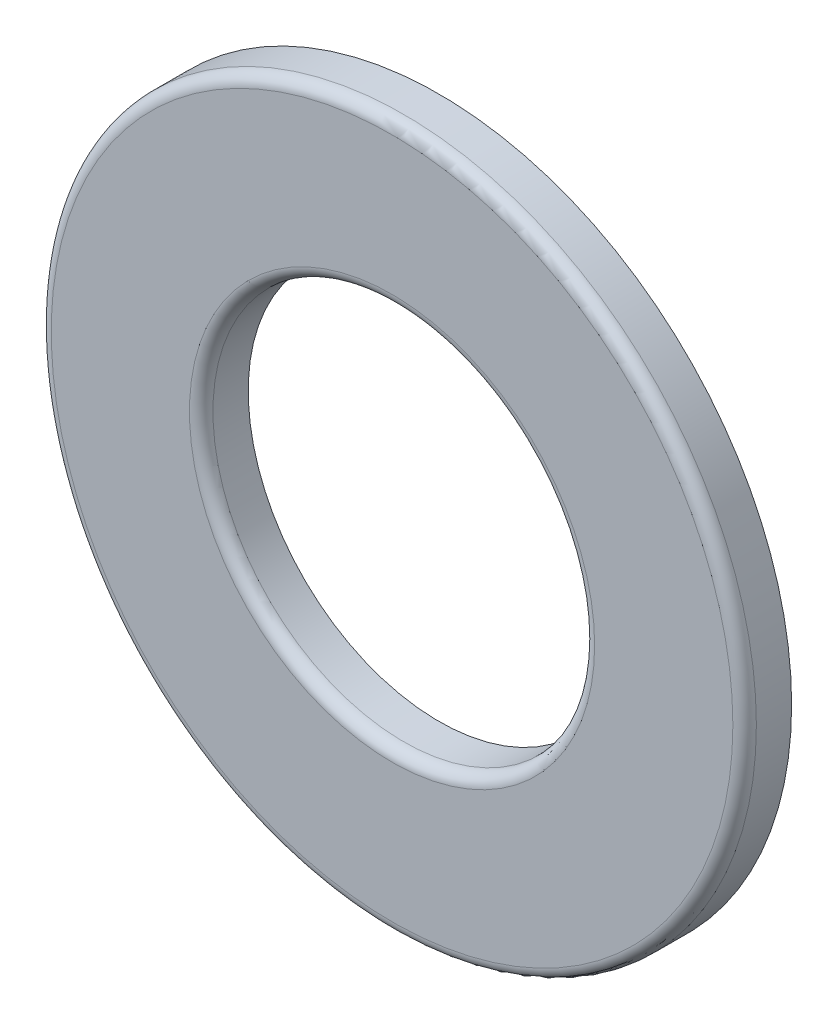
ISO-10303-21;
HEADER;
FILE_DESCRIPTION(('STEP AP214'),'2;1');
FILE_NAME('part.step','',(''),(''),'','','');
FILE_SCHEMA(('AUTOMOTIVE_DESIGN { 1 0 10303 214 1 1 1 1 }'));
ENDSEC;
DATA;
#1=APPLICATION_CONTEXT('core data for automotive mechanical design processes');
#2=APPLICATION_PROTOCOL_DEFINITION('international standard','automotive_design',2000,#1);
#3=PRODUCT_CONTEXT('',#1,'mechanical');
#4=PRODUCT('Part','Part','',(#3));
#5=PRODUCT_RELATED_PRODUCT_CATEGORY('part','',(#4));
#6=PRODUCT_DEFINITION_FORMATION('','',#4);
#7=PRODUCT_DEFINITION_CONTEXT('part definition',#1,'design');
#8=PRODUCT_DEFINITION('design','',#6,#7);
#9=PRODUCT_DEFINITION_SHAPE('','',#8);
#10=(LENGTH_UNIT() NAMED_UNIT(*) SI_UNIT(.MILLI.,.METRE.));
#11=(NAMED_UNIT(*) PLANE_ANGLE_UNIT() SI_UNIT($,.RADIAN.));
#12=(NAMED_UNIT(*) SI_UNIT($,.STERADIAN.) SOLID_ANGLE_UNIT());
#13=UNCERTAINTY_MEASURE_WITH_UNIT(LENGTH_MEASURE(1.E-05),#10,'distance_accuracy_value','');
#14=(GEOMETRIC_REPRESENTATION_CONTEXT(3) GLOBAL_UNCERTAINTY_ASSIGNED_CONTEXT((#13)) GLOBAL_UNIT_ASSIGNED_CONTEXT((#10,
#11,#12)) REPRESENTATION_CONTEXT('',''));
#15=CARTESIAN_POINT('',(0.,0.,0.));
#16=DIRECTION('',(0.,0.,1.));
#17=DIRECTION('',(1.,0.,0.));
#18=AXIS2_PLACEMENT_3D('',#15,#16,#17);
#19=CARTESIAN_POINT('',(0.,0.,0.634999999999997));
#20=DIRECTION('',(0.,0.,1.));
#21=DIRECTION('',(1.,0.,0.));
#22=AXIS2_PLACEMENT_3D('',#19,#20,#21);
#23=PLANE('',#22);
#24=CARTESIAN_POINT('',(0.,0.,0.634999999999997));
#25=DIRECTION('',(0.,0.,1.));
#26=DIRECTION('',(1.,0.,0.));
#27=AXIS2_PLACEMENT_3D('',#24,#25,#26);
#28=CIRCLE('',#27,9.2075);
#29=CARTESIAN_POINT('',(9.2075,0.,0.634999999999997));
#30=VERTEX_POINT('',#29);
#31=EDGE_CURVE('E44',#30,#30,#28,.T.);
#32=ORIENTED_EDGE('',*,*,#31,.T.);
#33=EDGE_LOOP('',(#32));
#34=FACE_BOUND('',#33,.T.);
#35=CARTESIAN_POINT('',(0.,0.,0.634999999999997));
#36=DIRECTION('',(0.,0.,1.));
#37=DIRECTION('',(1.,0.,0.));
#38=AXIS2_PLACEMENT_3D('',#35,#36,#37);
#39=CIRCLE('',#38,5.4737);
#40=CARTESIAN_POINT('',(5.4737,0.,0.634999999999997));
#41=VERTEX_POINT('',#40);
#42=EDGE_CURVE('E48',#41,#41,#39,.F.);
#43=ORIENTED_EDGE('',*,*,#42,.T.);
#44=EDGE_LOOP('',(#43));
#45=FACE_BOUND('',#44,.T.);
#46=ADVANCED_FACE('F33',(#34,#45),#23,.T.);
#47=CARTESIAN_POINT('',(0.,0.,0.634999999999997));
#48=DIRECTION('',(0.,0.,-1.));
#49=DIRECTION('',(-1.,0.,0.));
#50=AXIS2_PLACEMENT_3D('',#47,#48,#49);
#51=CYLINDRICAL_SURFACE('',#50,9.525);
#52=CARTESIAN_POINT('',(0.,0.,0.317499999999997));
#53=DIRECTION('',(0.,0.,1.));
#54=DIRECTION('',(1.,0.,0.));
#55=AXIS2_PLACEMENT_3D('',#52,#53,#54);
#56=CIRCLE('',#55,9.525);
#57=CARTESIAN_POINT('',(9.525,0.,0.317499999999997));
#58=VERTEX_POINT('',#57);
#59=EDGE_CURVE('E40',#58,#58,#56,.F.);
#60=ORIENTED_EDGE('',*,*,#59,.T.);
#61=EDGE_LOOP('',(#60));
#62=FACE_BOUND('',#61,.T.);
#63=CARTESIAN_POINT('',(0.,0.,-0.635000000000003));
#64=DIRECTION('',(0.,0.,1.));
#65=DIRECTION('',(1.,0.,0.));
#66=AXIS2_PLACEMENT_3D('',#63,#64,#65);
#67=CIRCLE('',#66,9.525);
#68=CARTESIAN_POINT('',(9.525,0.,-0.635000000000003));
#69=VERTEX_POINT('',#68);
#70=EDGE_CURVE('E53',#69,#69,#67,.T.);
#71=ORIENTED_EDGE('',*,*,#70,.T.);
#72=EDGE_LOOP('',(#71));
#73=FACE_BOUND('',#72,.T.);
#74=ADVANCED_FACE('F65',(#62,#73),#51,.T.);
#75=CARTESIAN_POINT('',(0.,0.,0.634999999999997));
#76=DIRECTION('',(0.,0.,-1.));
#77=DIRECTION('',(-1.,0.,0.));
#78=AXIS2_PLACEMENT_3D('',#75,#76,#77);
#79=CYLINDRICAL_SURFACE('',#78,5.1562);
#80=CARTESIAN_POINT('',(0.,0.,0.317499999999997));
#81=DIRECTION('',(0.,0.,1.));
#82=DIRECTION('',(1.,0.,0.));
#83=AXIS2_PLACEMENT_3D('',#80,#81,#82);
#84=CIRCLE('',#83,5.1562);
#85=CARTESIAN_POINT('',(5.1562,0.,0.317499999999997));
#86=VERTEX_POINT('',#85);
#87=EDGE_CURVE('E10',#86,#86,#84,.T.);
#88=ORIENTED_EDGE('',*,*,#87,.T.);
#89=EDGE_LOOP('',(#88));
#90=FACE_BOUND('',#89,.T.);
#91=CARTESIAN_POINT('',(0.,0.,-0.635000000000003));
#92=DIRECTION('',(0.,0.,1.));
#93=DIRECTION('',(1.,0.,0.));
#94=AXIS2_PLACEMENT_3D('',#91,#92,#93);
#95=CIRCLE('',#94,5.1562);
#96=CARTESIAN_POINT('',(5.1562,0.,-0.635000000000003));
#97=VERTEX_POINT('',#96);
#98=EDGE_CURVE('E56',#97,#97,#95,.T.);
#99=ORIENTED_EDGE('',*,*,#98,.F.);
#100=EDGE_LOOP('',(#99));
#101=FACE_BOUND('',#100,.T.);
#102=ADVANCED_FACE('F63',(#90,#101),#79,.F.);
#103=CARTESIAN_POINT('',(0.,0.,-0.635000000000003));
#104=DIRECTION('',(0.,0.,1.));
#105=DIRECTION('',(1.,0.,0.));
#106=AXIS2_PLACEMENT_3D('',#103,#104,#105);
#107=PLANE('',#106);
#108=ORIENTED_EDGE('',*,*,#98,.T.);
#109=EDGE_LOOP('',(#108));
#110=FACE_BOUND('',#109,.T.);
#111=ORIENTED_EDGE('',*,*,#70,.F.);
#112=EDGE_LOOP('',(#111));
#113=FACE_BOUND('',#112,.T.);
#114=ADVANCED_FACE('F60',(#110,#113),#107,.F.);
#115=CARTESIAN_POINT('',(0.,0.,0.317499999999997));
#116=DIRECTION('',(0.,0.,1.));
#117=DIRECTION('',(1.,0.,0.));
#118=AXIS2_PLACEMENT_3D('',#115,#116,#117);
#119=TOROIDAL_SURFACE('',#118,9.2075,0.3175);
#120=ORIENTED_EDGE('',*,*,#59,.F.);
#121=EDGE_LOOP('',(#120));
#122=FACE_BOUND('',#121,.T.);
#123=ORIENTED_EDGE('',*,*,#31,.F.);
#124=EDGE_LOOP('',(#123));
#125=FACE_BOUND('',#124,.T.);
#126=ADVANCED_FACE('F71',(#122,#125),#119,.T.);
#127=CARTESIAN_POINT('',(0.,0.,0.317499999999997));
#128=DIRECTION('',(0.,0.,1.));
#129=DIRECTION('',(1.,0.,0.));
#130=AXIS2_PLACEMENT_3D('',#127,#128,#129);
#131=TOROIDAL_SURFACE('',#130,5.4737,0.3175);
#132=ORIENTED_EDGE('',*,*,#42,.F.);
#133=EDGE_LOOP('',(#132));
#134=FACE_BOUND('',#133,.T.);
#135=ORIENTED_EDGE('',*,*,#87,.F.);
#136=EDGE_LOOP('',(#135));
#137=FACE_BOUND('',#136,.T.);
#138=ADVANCED_FACE('F35',(#134,#137),#131,.T.);
#139=CLOSED_SHELL('',(#46,#74,#102,#114,#126,#138));
#140=MANIFOLD_SOLID_BREP('B2',#139);
#141=ADVANCED_BREP_SHAPE_REPRESENTATION('',(#18,#140),#14);
#142=SHAPE_DEFINITION_REPRESENTATION(#9,#141);
ENDSEC;
END-ISO-10303-21;
